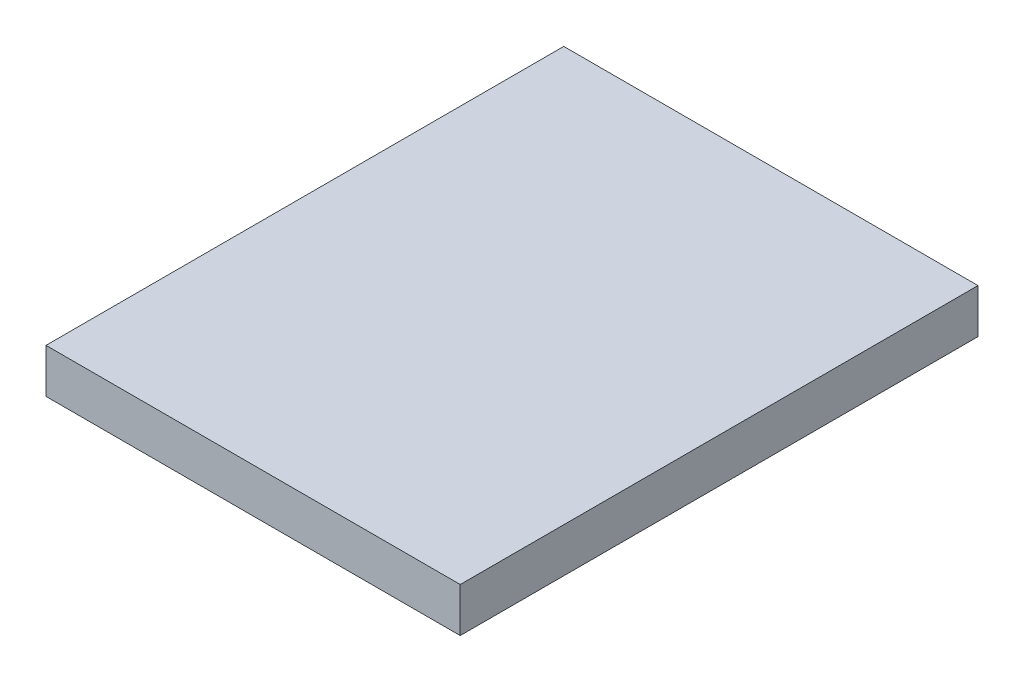
ISO-10303-21;
HEADER;
FILE_DESCRIPTION(('STEP AP214'),'2;1');
FILE_NAME('part.step','',(''),(''),'','','');
FILE_SCHEMA(('AUTOMOTIVE_DESIGN { 1 0 10303 214 1 1 1 1 }'));
ENDSEC;
DATA;
#1=APPLICATION_CONTEXT('core data for automotive mechanical design processes');
#2=APPLICATION_PROTOCOL_DEFINITION('international standard','automotive_design',2000,#1);
#3=PRODUCT_CONTEXT('',#1,'mechanical');
#4=PRODUCT('Part','Part','',(#3));
#5=PRODUCT_RELATED_PRODUCT_CATEGORY('part','',(#4));
#6=PRODUCT_DEFINITION_FORMATION('','',#4);
#7=PRODUCT_DEFINITION_CONTEXT('part definition',#1,'design');
#8=PRODUCT_DEFINITION('design','',#6,#7);
#9=PRODUCT_DEFINITION_SHAPE('','',#8);
#10=(LENGTH_UNIT() NAMED_UNIT(*) SI_UNIT(.MILLI.,.METRE.));
#11=(NAMED_UNIT(*) PLANE_ANGLE_UNIT() SI_UNIT($,.RADIAN.));
#12=(NAMED_UNIT(*) SI_UNIT($,.STERADIAN.) SOLID_ANGLE_UNIT());
#13=UNCERTAINTY_MEASURE_WITH_UNIT(LENGTH_MEASURE(1.E-05),#10,'distance_accuracy_value','');
#14=(GEOMETRIC_REPRESENTATION_CONTEXT(3) GLOBAL_UNCERTAINTY_ASSIGNED_CONTEXT((#13)) GLOBAL_UNIT_ASSIGNED_CONTEXT((#10,
#11,#12)) REPRESENTATION_CONTEXT('',''));
#15=CARTESIAN_POINT('',(0.,0.,0.));
#16=DIRECTION('',(0.,0.,1.));
#17=DIRECTION('',(1.,0.,0.));
#18=AXIS2_PLACEMENT_3D('',#15,#16,#17);
#19=CARTESIAN_POINT('',(-22.,4.7,27.5));
#20=DIRECTION('',(1.,0.,0.));
#21=DIRECTION('',(0.,0.,-1.));
#22=AXIS2_PLACEMENT_3D('',#19,#20,#21);
#23=PLANE('',#22);
#24=DIRECTION('',(0.,0.,1.));
#25=VECTOR('',#24,1.);
#26=CARTESIAN_POINT('',(-22.,0.,27.5));
#27=LINE('',#26,#25);
#28=CARTESIAN_POINT('',(-22.,0.,-27.5));
#29=VERTEX_POINT('',#28);
#30=CARTESIAN_POINT('',(-22.,0.,27.5));
#31=VERTEX_POINT('',#30);
#32=EDGE_CURVE('E95',#29,#31,#27,.T.);
#33=ORIENTED_EDGE('',*,*,#32,.T.);
#34=DIRECTION('',(0.,-1.,0.));
#35=VECTOR('',#34,1.);
#36=CARTESIAN_POINT('',(-22.,4.7,27.5));
#37=LINE('',#36,#35);
#38=CARTESIAN_POINT('',(-22.,4.7,27.5));
#39=VERTEX_POINT('',#38);
#40=EDGE_CURVE('E11',#39,#31,#37,.T.);
#41=ORIENTED_EDGE('',*,*,#40,.F.);
#42=DIRECTION('',(0.,0.,1.));
#43=VECTOR('',#42,1.);
#44=CARTESIAN_POINT('',(-22.,4.7,27.5));
#45=LINE('',#44,#43);
#46=CARTESIAN_POINT('',(-22.,4.7,-27.5));
#47=VERTEX_POINT('',#46);
#48=EDGE_CURVE('E83',#47,#39,#45,.T.);
#49=ORIENTED_EDGE('',*,*,#48,.F.);
#50=DIRECTION('',(0.,-1.,0.));
#51=VECTOR('',#50,1.);
#52=CARTESIAN_POINT('',(-22.,4.7,-27.5));
#53=LINE('',#52,#51);
#54=EDGE_CURVE('E91',#47,#29,#53,.T.);
#55=ORIENTED_EDGE('',*,*,#54,.T.);
#56=EDGE_LOOP('',(#33,#41,#49,#55));
#57=FACE_BOUND('',#56,.T.);
#58=ADVANCED_FACE('F32',(#57),#23,.F.);
#59=CARTESIAN_POINT('',(22.,4.7,27.5));
#60=DIRECTION('',(0.,0.,-1.));
#61=DIRECTION('',(-1.,0.,0.));
#62=AXIS2_PLACEMENT_3D('',#59,#60,#61);
#63=PLANE('',#62);
#64=DIRECTION('',(1.,0.,0.));
#65=VECTOR('',#64,1.);
#66=CARTESIAN_POINT('',(22.,0.,27.5));
#67=LINE('',#66,#65);
#68=CARTESIAN_POINT('',(22.,0.,27.5));
#69=VERTEX_POINT('',#68);
#70=EDGE_CURVE('E87',#31,#69,#67,.T.);
#71=ORIENTED_EDGE('',*,*,#70,.T.);
#72=DIRECTION('',(0.,-1.,0.));
#73=VECTOR('',#72,1.);
#74=CARTESIAN_POINT('',(22.,4.7,27.5));
#75=LINE('',#74,#73);
#76=CARTESIAN_POINT('',(22.,4.7,27.5));
#77=VERTEX_POINT('',#76);
#78=EDGE_CURVE('E40',#77,#69,#75,.T.);
#79=ORIENTED_EDGE('',*,*,#78,.F.);
#80=DIRECTION('',(1.,0.,0.));
#81=VECTOR('',#80,1.);
#82=CARTESIAN_POINT('',(22.,4.7,27.5));
#83=LINE('',#82,#81);
#84=EDGE_CURVE('E78',#39,#77,#83,.T.);
#85=ORIENTED_EDGE('',*,*,#84,.F.);
#86=ORIENTED_EDGE('',*,*,#40,.T.);
#87=EDGE_LOOP('',(#71,#79,#85,#86));
#88=FACE_BOUND('',#87,.T.);
#89=ADVANCED_FACE('F86',(#88),#63,.F.);
#90=CARTESIAN_POINT('',(22.,4.7,27.5));
#91=DIRECTION('',(-1.,0.,0.));
#92=DIRECTION('',(0.,0.,1.));
#93=AXIS2_PLACEMENT_3D('',#90,#91,#92);
#94=PLANE('',#93);
#95=DIRECTION('',(0.,0.,-1.));
#96=VECTOR('',#95,1.);
#97=CARTESIAN_POINT('',(22.,0.,27.5));
#98=LINE('',#97,#96);
#99=CARTESIAN_POINT('',(22.,0.,-27.5));
#100=VERTEX_POINT('',#99);
#101=EDGE_CURVE('E65',#69,#100,#98,.T.);
#102=ORIENTED_EDGE('',*,*,#101,.T.);
#103=DIRECTION('',(0.,-1.,0.));
#104=VECTOR('',#103,1.);
#105=CARTESIAN_POINT('',(22.,4.7,-27.5));
#106=LINE('',#105,#104);
#107=CARTESIAN_POINT('',(22.,4.7,-27.5));
#108=VERTEX_POINT('',#107);
#109=EDGE_CURVE('E88',#108,#100,#106,.T.);
#110=ORIENTED_EDGE('',*,*,#109,.F.);
#111=DIRECTION('',(0.,0.,-1.));
#112=VECTOR('',#111,1.);
#113=CARTESIAN_POINT('',(22.,4.7,27.5));
#114=LINE('',#113,#112);
#115=EDGE_CURVE('E81',#77,#108,#114,.T.);
#116=ORIENTED_EDGE('',*,*,#115,.F.);
#117=ORIENTED_EDGE('',*,*,#78,.T.);
#118=EDGE_LOOP('',(#102,#110,#116,#117));
#119=FACE_BOUND('',#118,.T.);
#120=ADVANCED_FACE('F89',(#119),#94,.F.);
#121=CARTESIAN_POINT('',(22.,4.7,-27.5));
#122=DIRECTION('',(0.,0.,1.));
#123=DIRECTION('',(1.,0.,0.));
#124=AXIS2_PLACEMENT_3D('',#121,#122,#123);
#125=PLANE('',#124);
#126=DIRECTION('',(-1.,0.,0.));
#127=VECTOR('',#126,1.);
#128=CARTESIAN_POINT('',(22.,0.,-27.5));
#129=LINE('',#128,#127);
#130=EDGE_CURVE('E71',#100,#29,#129,.T.);
#131=ORIENTED_EDGE('',*,*,#130,.T.);
#132=ORIENTED_EDGE('',*,*,#54,.F.);
#133=DIRECTION('',(-1.,0.,0.));
#134=VECTOR('',#133,1.);
#135=CARTESIAN_POINT('',(22.,4.7,-27.5));
#136=LINE('',#135,#134);
#137=EDGE_CURVE('E48',#108,#47,#136,.T.);
#138=ORIENTED_EDGE('',*,*,#137,.F.);
#139=ORIENTED_EDGE('',*,*,#109,.T.);
#140=EDGE_LOOP('',(#131,#132,#138,#139));
#141=FACE_BOUND('',#140,.T.);
#142=ADVANCED_FACE('F102',(#141),#125,.F.);
#143=CARTESIAN_POINT('',(0.,4.7,0.));
#144=DIRECTION('',(0.,1.,0.));
#145=DIRECTION('',(0.,0.,1.));
#146=AXIS2_PLACEMENT_3D('',#143,#144,#145);
#147=PLANE('',#146);
#148=ORIENTED_EDGE('',*,*,#48,.T.);
#149=ORIENTED_EDGE('',*,*,#84,.T.);
#150=ORIENTED_EDGE('',*,*,#115,.T.);
#151=ORIENTED_EDGE('',*,*,#137,.T.);
#152=EDGE_LOOP('',(#148,#149,#150,#151));
#153=FACE_BOUND('',#152,.T.);
#154=ADVANCED_FACE('F79',(#153),#147,.T.);
#155=CARTESIAN_POINT('',(0.,0.,0.));
#156=DIRECTION('',(0.,1.,0.));
#157=DIRECTION('',(0.,0.,1.));
#158=AXIS2_PLACEMENT_3D('',#155,#156,#157);
#159=PLANE('',#158);
#160=ORIENTED_EDGE('',*,*,#32,.F.);
#161=ORIENTED_EDGE('',*,*,#130,.F.);
#162=ORIENTED_EDGE('',*,*,#101,.F.);
#163=ORIENTED_EDGE('',*,*,#70,.F.);
#164=EDGE_LOOP('',(#160,#161,#162,#163));
#165=FACE_BOUND('',#164,.T.);
#166=ADVANCED_FACE('F105',(#165),#159,.F.);
#167=CLOSED_SHELL('',(#58,#89,#120,#142,#154,#166));
#168=MANIFOLD_SOLID_BREP('B2',#167);
#169=ADVANCED_BREP_SHAPE_REPRESENTATION('',(#18,#168),#14);
#170=SHAPE_DEFINITION_REPRESENTATION(#9,#169);
ENDSEC;
END-ISO-10303-21;
